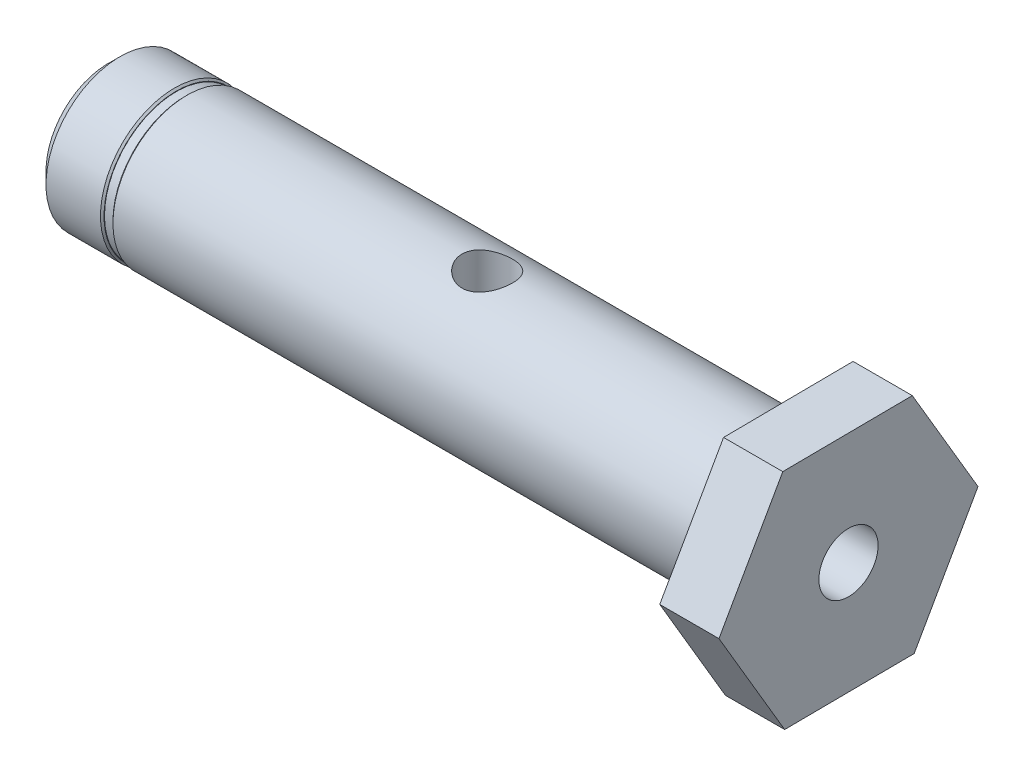
ISO-10303-21;
HEADER;
FILE_DESCRIPTION(('STEP AP214'),'2;1');
FILE_NAME('part.step','',(''),(''),'','','');
FILE_SCHEMA(('AUTOMOTIVE_DESIGN { 1 0 10303 214 1 1 1 1 }'));
ENDSEC;
DATA;
#1=APPLICATION_CONTEXT('core data for automotive mechanical design processes');
#2=APPLICATION_PROTOCOL_DEFINITION('international standard','automotive_design',2000,#1);
#3=PRODUCT_CONTEXT('',#1,'mechanical');
#4=PRODUCT('Part','Part','',(#3));
#5=PRODUCT_RELATED_PRODUCT_CATEGORY('part','',(#4));
#6=PRODUCT_DEFINITION_FORMATION('','',#4);
#7=PRODUCT_DEFINITION_CONTEXT('part definition',#1,'design');
#8=PRODUCT_DEFINITION('design','',#6,#7);
#9=PRODUCT_DEFINITION_SHAPE('','',#8);
#10=(LENGTH_UNIT() NAMED_UNIT(*) SI_UNIT(.MILLI.,.METRE.));
#11=(NAMED_UNIT(*) PLANE_ANGLE_UNIT() SI_UNIT($,.RADIAN.));
#12=(NAMED_UNIT(*) SI_UNIT($,.STERADIAN.) SOLID_ANGLE_UNIT());
#13=UNCERTAINTY_MEASURE_WITH_UNIT(LENGTH_MEASURE(1.E-05),#10,'distance_accuracy_value','');
#14=(GEOMETRIC_REPRESENTATION_CONTEXT(3) GLOBAL_UNCERTAINTY_ASSIGNED_CONTEXT((#13)) GLOBAL_UNIT_ASSIGNED_CONTEXT((#10,
#11,#12)) REPRESENTATION_CONTEXT('',''));
#15=CARTESIAN_POINT('',(0.,0.,0.));
#16=DIRECTION('',(0.,0.,1.));
#17=DIRECTION('',(1.,0.,0.));
#18=AXIS2_PLACEMENT_3D('',#15,#16,#17);
#19=CARTESIAN_POINT('',(115.,0.,0.));
#20=DIRECTION('',(-1.,0.,0.));
#21=DIRECTION('',(0.,0.,1.));
#22=AXIS2_PLACEMENT_3D('',#19,#20,#21);
#23=CYLINDRICAL_SURFACE('',#22,12.5);
#24=CARTESIAN_POINT('',(13.3,0.,0.));
#25=DIRECTION('',(-1.,0.,0.));
#26=DIRECTION('',(0.,0.,1.));
#27=AXIS2_PLACEMENT_3D('',#24,#25,#26);
#28=CIRCLE('',#27,12.5);
#29=CARTESIAN_POINT('',(13.3,0.,12.5));
#30=VERTEX_POINT('',#29);
#31=EDGE_CURVE('E179',#30,#30,#28,.F.);
#32=ORIENTED_EDGE('',*,*,#31,.T.);
#33=EDGE_LOOP('',(#32));
#34=FACE_BOUND('',#33,.T.);
#35=CARTESIAN_POINT('',(115.,0.,0.));
#36=DIRECTION('',(1.,0.,0.));
#37=DIRECTION('',(0.,0.,-1.));
#38=AXIS2_PLACEMENT_3D('',#35,#36,#37);
#39=CIRCLE('',#38,12.5);
#40=CARTESIAN_POINT('',(115.,0.,-12.5));
#41=VERTEX_POINT('',#40);
#42=EDGE_CURVE('E158',#41,#41,#39,.T.);
#43=ORIENTED_EDGE('',*,*,#42,.F.);
#44=EDGE_LOOP('',(#43));
#45=FACE_BOUND('',#44,.T.);
#46=CARTESIAN_POINT('',(64.,11.7553179455087,4.25000000000001));
#47=CARTESIAN_POINT('',(63.7688082243958,11.7553163048564,4.25000208635939));
#48=CARTESIAN_POINT('',(63.5376306111017,11.7622127031611,4.23107177309128));
#49=CARTESIAN_POINT('',(63.0821430943685,11.7889024426549,4.15611937649357));
#50=CARTESIAN_POINT('',(62.8578340991343,11.8086974817267,4.10009241001671));
#51=CARTESIAN_POINT('',(62.4227597886088,11.8586887228587,3.95315727615973));
#52=CARTESIAN_POINT('',(62.2119680573483,11.8888638561852,3.86231972243054));
#53=CARTESIAN_POINT('',(61.8085451145788,11.9561841704273,3.64858465717114));
#54=CARTESIAN_POINT('',(61.6159181723876,11.9933309838111,3.52567963418154));
#55=CARTESIAN_POINT('',(61.2464478386544,12.0721055733369,3.24593667986677));
#56=CARTESIAN_POINT('',(61.0704516300864,12.1138482614208,3.08801191357714));
#57=CARTESIAN_POINT('',(60.7468608782459,12.1961419607755,2.74502977872382));
#58=CARTESIAN_POINT('',(60.5992711064602,12.2366927708767,2.55996786105974));
#59=CARTESIAN_POINT('',(60.332803063851,12.3133695834904,2.16173358215594));
#60=CARTESIAN_POINT('',(60.2148175164114,12.3493447648353,1.9479322684075));
#61=CARTESIAN_POINT('',(60.0168239888865,12.4114588114545,1.50208314069309));
#62=CARTESIAN_POINT('',(59.9368053327207,12.4376004414402,1.27004047751297));
#63=CARTESIAN_POINT('',(59.819904815012,12.4762877361144,0.803181808925194));
#64=CARTESIAN_POINT('',(59.781570565411,12.4892899687544,0.568768024092829));
#65=CARTESIAN_POINT('',(59.7445035304582,12.5018568685094,0.0964986813327515));
#66=CARTESIAN_POINT('',(59.7457601346843,12.5014251359524,-0.141355937364765));
#67=CARTESIAN_POINT('',(59.7869293778599,12.4874792686763,-0.60345524442996));
#68=CARTESIAN_POINT('',(59.8252633639397,12.474499409838,-0.827859366125014));
#69=CARTESIAN_POINT('',(59.9368817672938,12.4375910854643,-1.26683563867679));
#70=CARTESIAN_POINT('',(60.0101685765457,12.4136618706201,-1.48140711554011));
#71=CARTESIAN_POINT('',(60.1905041300385,12.3568751775078,-1.8980164033555));
#72=CARTESIAN_POINT('',(60.2979923868106,12.3239022889639,-2.09984758406958));
#73=CARTESIAN_POINT('',(60.5433137607319,12.2524460502634,-2.48306659203639));
#74=CARTESIAN_POINT('',(60.681155550554,12.2139611262977,-2.66444855405648));
#75=CARTESIAN_POINT('',(60.9911745301492,12.1333048225972,-3.01099992399038));
#76=CARTESIAN_POINT('',(61.1647002678062,12.0910451976412,-3.17494418986543));
#77=CARTESIAN_POINT('',(61.5371276123441,12.0091752957356,-3.4718123267595));
#78=CARTESIAN_POINT('',(61.7360334573203,11.969565462949,-3.60473100646118));
#79=CARTESIAN_POINT('',(62.1575999287105,11.8969851778806,-3.83756473071075));
#80=CARTESIAN_POINT('',(62.3805784989992,11.8641260508176,-3.93694148373782));
#81=CARTESIAN_POINT('',(62.841505720852,11.8100543141711,-4.09631339640206));
#82=CARTESIAN_POINT('',(63.0794477426114,11.7888365866345,-4.15632586418346));
#83=CARTESIAN_POINT('',(63.551640096284,11.7616154920121,-4.23272709729825));
#84=CARTESIAN_POINT('',(63.7855435602831,11.7549476419358,-4.25102291540233));
#85=CARTESIAN_POINT('',(64.253124045222,11.7557200468072,-4.24888913268011));
#86=CARTESIAN_POINT('',(64.4868011009053,11.7631576046845,-4.22846693505826));
#87=CARTESIAN_POINT('',(64.9384588804628,11.7906383598649,-4.15119312232909));
#88=CARTESIAN_POINT('',(65.1567015418879,11.8102149538794,-4.09568855042673));
#89=CARTESIAN_POINT('',(65.5807242875293,11.8592485003546,-3.9514537893724));
#90=CARTESIAN_POINT('',(65.7865020988783,11.888707248384,-3.86271756175014));
#91=CARTESIAN_POINT('',(66.1872093806727,11.9553766913527,-3.65124748009679));
#92=CARTESIAN_POINT('',(66.3815646574045,11.9928092351957,-3.52749746510955));
#93=CARTESIAN_POINT('',(66.7474387202912,12.0707872460142,-3.25065304738288));
#94=CARTESIAN_POINT('',(66.9189504874256,12.1113336637695,-3.09754966045709));
#95=CARTESIAN_POINT('',(67.2432047947156,12.1934414759765,-2.75718975144257));
#96=CARTESIAN_POINT('',(67.3945664440502,12.2349510943746,-2.56860120561713));
#97=CARTESIAN_POINT('',(67.6635958933644,12.3123024299383,-2.16767839127812));
#98=CARTESIAN_POINT('',(67.7812647403048,12.3481443232058,-1.95534486089481));
#99=CARTESIAN_POINT('',(67.9785220351902,12.4099713333259,-1.51390748124953));
#100=CARTESIAN_POINT('',(68.0583455126643,12.4360170721838,-1.28491760269166));
#101=CARTESIAN_POINT('',(68.1780013666957,12.4755748071516,-0.815699002397323));
#102=CARTESIAN_POINT('',(68.2178488293486,12.489091531298,-0.575474556193985));
#103=CARTESIAN_POINT('',(68.2550209742181,12.50169717107,-0.103211830111087));
#104=CARTESIAN_POINT('',(68.2543244388139,12.501457487594,0.128654421017074));
#105=CARTESIAN_POINT('',(68.2153415064129,12.4882452162174,0.588812496753035));
#106=CARTESIAN_POINT('',(68.177058369155,12.4752737324961,0.817104629585829));
#107=CARTESIAN_POINT('',(68.0653164091026,12.438311718123,1.25973733436524));
#108=CARTESIAN_POINT('',(67.9924696892469,12.4145132190251,1.47424962273104));
#109=CARTESIAN_POINT('',(67.8142408217572,12.3583495347409,1.88808156366101));
#110=CARTESIAN_POINT('',(67.7088527146591,12.3259827805629,2.08739842506849));
#111=CARTESIAN_POINT('',(67.4639468867196,12.2544776933187,2.47341490547125));
#112=CARTESIAN_POINT('',(67.3232880355071,12.2151293747917,2.65935109194141));
#113=CARTESIAN_POINT('',(67.0137518219909,12.1345744052391,3.00562250583219));
#114=CARTESIAN_POINT('',(66.8448652740194,12.0933671524889,3.16594936631593));
#115=CARTESIAN_POINT('',(66.4753569274188,12.0117094140378,3.46317770167239));
#116=CARTESIAN_POINT('',(66.2737145025818,11.9713600094017,3.59884229876754));
#117=CARTESIAN_POINT('',(65.8492278836957,11.8980483180312,3.83428262236865));
#118=CARTESIAN_POINT('',(65.6263881664128,11.865084476414,3.9340659056497));
#119=CARTESIAN_POINT('',(65.1729356054837,11.8116162303556,4.0917578844551));
#120=CARTESIAN_POINT('',(64.9427949668864,11.7907491035731,4.15089676108841));
#121=CARTESIAN_POINT('',(64.4750959809143,11.7626034107323,4.23000923378122));
#122=CARTESIAN_POINT('',(64.237540515052,11.7553196312149,4.24999785634727));
#123=CARTESIAN_POINT('',(64.,11.7553179455087,4.25000000000001));
#124=B_SPLINE_CURVE_WITH_KNOTS('',3,(#46,#47,#48,#49,#50,#51,#52,#53,#54,#55,#56,#57,#58,#59,
#60,#61,#62,#63,#64,#65,#66,#67,#68,#69,#70,#71,#72,#73,#74,#75,#76,#77,#78,#79,#80,#81,#82,#83,
#84,#85,#86,#87,#88,#89,#90,#91,#92,#93,#94,#95,#96,#97,#98,#99,#100,#101,#102,#103,#104,#105,
#106,#107,#108,#109,#110,#111,#112,#113,#114,#115,#116,#117,#118,#119,#120,#121,#122,#123),
.UNSPECIFIED.,.T.,.F.,(4,2,2,2,2,2,2,2,2,2,2,2,2,2,2,2,2,2,2,2,2,2,2,2,2,2,2,2,2,2,2,2,2,2,2,2,
2,2,4),(0.,0.692694920384622,1.38548104047712,2.07686921235574,2.76841948009048,
3.48554525708903,4.20279138623514,4.9395969186036,5.67619514235266,6.38621339082409,
7.0960413547094,7.77691942027096,8.45784408804077,9.14789875658827,9.8381508453689,
10.5621283168264,11.2862268402086,12.0214474433795,12.7563445591683,13.456908323454,
14.1573381476705,14.8323840278356,15.5075526290563,16.2047830406201,16.902227195157,
17.6348081128836,18.3673662641226,19.0953134364972,19.8229857936747,20.515174766614,
21.2073037140138,21.8876085563469,22.5680380602091,23.2742297793021,23.9806517515895,
24.7161707244757,25.4515347027242,26.1635249917672,26.8752419537226),.UNSPECIFIED.);
#125=CARTESIAN_POINT('',(64.,11.7553179455087,4.25000000000001));
#126=VERTEX_POINT('',#125);
#127=EDGE_CURVE('E289',#126,#126,#124,.T.);
#128=ORIENTED_EDGE('',*,*,#127,.T.);
#129=EDGE_LOOP('',(#128));
#130=FACE_BOUND('',#129,.T.);
#131=CARTESIAN_POINT('',(64.,-11.7553179455087,4.25000000000001));
#132=CARTESIAN_POINT('',(64.2311917756042,-11.7553163048564,4.25000208635939));
#133=CARTESIAN_POINT('',(64.4623693888983,-11.7622127031611,4.23107177309128));
#134=CARTESIAN_POINT('',(64.9178569056315,-11.7889024426549,4.15611937649357));
#135=CARTESIAN_POINT('',(65.1421659008657,-11.8086974817267,4.10009241001671));
#136=CARTESIAN_POINT('',(65.5772402113912,-11.8586887228587,3.95315727615973));
#137=CARTESIAN_POINT('',(65.7880319426517,-11.8888638561852,3.86231972243054));
#138=CARTESIAN_POINT('',(66.1914548854212,-11.9561841704273,3.64858465717114));
#139=CARTESIAN_POINT('',(66.3840818276124,-11.9933309838111,3.52567963418154));
#140=CARTESIAN_POINT('',(66.7535521613456,-12.0721055733369,3.24593667986676));
#141=CARTESIAN_POINT('',(66.9295483699136,-12.1138482614208,3.08801191357713));
#142=CARTESIAN_POINT('',(67.2531391217541,-12.1961419607755,2.74502977872382));
#143=CARTESIAN_POINT('',(67.4007288935398,-12.2366927708767,2.55996786105974));
#144=CARTESIAN_POINT('',(67.667196936149,-12.3133695834904,2.16173358215593));
#145=CARTESIAN_POINT('',(67.7851824835886,-12.3493447648353,1.9479322684075));
#146=CARTESIAN_POINT('',(67.9831760111135,-12.4114588114545,1.50208314069309));
#147=CARTESIAN_POINT('',(68.0631946672793,-12.4376004414402,1.27004047751297));
#148=CARTESIAN_POINT('',(68.180095184988,-12.4762877361144,0.803181808925201));
#149=CARTESIAN_POINT('',(68.218429434589,-12.4892899687544,0.568768024092834));
#150=CARTESIAN_POINT('',(68.2554964695418,-12.5018568685094,0.0964986813327555));
#151=CARTESIAN_POINT('',(68.2542398653157,-12.5014251359524,-0.141355937364761));
#152=CARTESIAN_POINT('',(68.2130706221401,-12.4874792686763,-0.603455244429957));
#153=CARTESIAN_POINT('',(68.1747366360604,-12.474499409838,-0.827859366125014));
#154=CARTESIAN_POINT('',(68.0631182327062,-12.4375910854643,-1.26683563867679));
#155=CARTESIAN_POINT('',(67.9898314234543,-12.4136618706201,-1.48140711554011));
#156=CARTESIAN_POINT('',(67.8094958699615,-12.3568751775078,-1.8980164033555));
#157=CARTESIAN_POINT('',(67.7020076131894,-12.3239022889639,-2.09984758406959));
#158=CARTESIAN_POINT('',(67.4566862392681,-12.2524460502634,-2.4830665920364));
#159=CARTESIAN_POINT('',(67.318844449446,-12.2139611262977,-2.66444855405648));
#160=CARTESIAN_POINT('',(67.0088254698508,-12.1333048225972,-3.01099992399038));
#161=CARTESIAN_POINT('',(66.8352997321938,-12.0910451976412,-3.17494418986544));
#162=CARTESIAN_POINT('',(66.4628723876559,-12.0091752957355,-3.47181232675951));
#163=CARTESIAN_POINT('',(66.2639665426797,-11.9695654629489,-3.60473100646119));
#164=CARTESIAN_POINT('',(65.8424000712894,-11.8969851778806,-3.83756473071075));
#165=CARTESIAN_POINT('',(65.6194215010008,-11.8641260508176,-3.93694148373782));
#166=CARTESIAN_POINT('',(65.158494279148,-11.8100543141711,-4.09631339640206));
#167=CARTESIAN_POINT('',(64.9205522573886,-11.7888365866345,-4.15632586418346));
#168=CARTESIAN_POINT('',(64.448359903716,-11.7616154920121,-4.23272709729825));
#169=CARTESIAN_POINT('',(64.2144564397169,-11.7549476419358,-4.25102291540233));
#170=CARTESIAN_POINT('',(63.746875954778,-11.7557200468072,-4.24888913268011));
#171=CARTESIAN_POINT('',(63.5131988990948,-11.7631576046845,-4.22846693505826));
#172=CARTESIAN_POINT('',(63.0615411195372,-11.7906383598649,-4.15119312232909));
#173=CARTESIAN_POINT('',(62.8432984581121,-11.8102149538794,-4.09568855042673));
#174=CARTESIAN_POINT('',(62.4192757124707,-11.8592485003546,-3.9514537893724));
#175=CARTESIAN_POINT('',(62.2134979011217,-11.888707248384,-3.86271756175014));
#176=CARTESIAN_POINT('',(61.8127906193273,-11.9553766913527,-3.6512474800968));
#177=CARTESIAN_POINT('',(61.6184353425955,-11.9928092351957,-3.52749746510956));
#178=CARTESIAN_POINT('',(61.2525612797088,-12.0707872460142,-3.25065304738289));
#179=CARTESIAN_POINT('',(61.0810495125744,-12.1113336637695,-3.0975496604571));
#180=CARTESIAN_POINT('',(60.7567952052844,-12.1934414759765,-2.75718975144258));
#181=CARTESIAN_POINT('',(60.6054335559498,-12.2349510943746,-2.56860120561712));
#182=CARTESIAN_POINT('',(60.3364041066356,-12.3123024299383,-2.16767839127811));
#183=CARTESIAN_POINT('',(60.2187352596952,-12.3481443232058,-1.9553448608948));
#184=CARTESIAN_POINT('',(60.0214779648098,-12.4099713333259,-1.51390748124952));
#185=CARTESIAN_POINT('',(59.9416544873357,-12.4360170721838,-1.28491760269165));
#186=CARTESIAN_POINT('',(59.8219986333043,-12.4755748071516,-0.815699002397321));
#187=CARTESIAN_POINT('',(59.7821511706514,-12.489091531298,-0.575474556193985));
#188=CARTESIAN_POINT('',(59.7449790257819,-12.50169717107,-0.103211830111089));
#189=CARTESIAN_POINT('',(59.7456755611861,-12.501457487594,0.128654421017073));
#190=CARTESIAN_POINT('',(59.7846584935871,-12.4882452162174,0.588812496753035));
#191=CARTESIAN_POINT('',(59.822941630845,-12.4752737324961,0.817104629585829));
#192=CARTESIAN_POINT('',(59.9346835908974,-12.438311718123,1.25973733436524));
#193=CARTESIAN_POINT('',(60.007530310753,-12.4145132190251,1.47424962273104));
#194=CARTESIAN_POINT('',(60.1857591782428,-12.3583495347409,1.88808156366101));
#195=CARTESIAN_POINT('',(60.2911472853409,-12.3259827805629,2.08739842506849));
#196=CARTESIAN_POINT('',(60.5360531132804,-12.2544776933187,2.47341490547125));
#197=CARTESIAN_POINT('',(60.6767119644929,-12.2151293747917,2.65935109194141));
#198=CARTESIAN_POINT('',(60.9862481780091,-12.1345744052391,3.0056225058322));
#199=CARTESIAN_POINT('',(61.1551347259806,-12.0933671524889,3.16594936631593));
#200=CARTESIAN_POINT('',(61.5246430725812,-12.0117094140378,3.46317770167239));
#201=CARTESIAN_POINT('',(61.7262854974182,-11.9713600094017,3.59884229876754));
#202=CARTESIAN_POINT('',(62.1507721163043,-11.8980483180312,3.83428262236865));
#203=CARTESIAN_POINT('',(62.3736118335872,-11.865084476414,3.9340659056497));
#204=CARTESIAN_POINT('',(62.8270643945163,-11.8116162303556,4.0917578844551));
#205=CARTESIAN_POINT('',(63.0572050331136,-11.7907491035731,4.15089676108841));
#206=CARTESIAN_POINT('',(63.5249040190857,-11.7626034107323,4.23000923378122));
#207=CARTESIAN_POINT('',(63.762459484948,-11.7553196312149,4.24999785634727));
#208=CARTESIAN_POINT('',(64.,-11.7553179455087,4.25000000000001));
#209=B_SPLINE_CURVE_WITH_KNOTS('',3,(#131,#132,#133,#134,#135,#136,#137,#138,#139,#140,#141,
#142,#143,#144,#145,#146,#147,#148,#149,#150,#151,#152,#153,#154,#155,#156,#157,#158,#159,#160,
#161,#162,#163,#164,#165,#166,#167,#168,#169,#170,#171,#172,#173,#174,#175,#176,#177,#178,#179,
#180,#181,#182,#183,#184,#185,#186,#187,#188,#189,#190,#191,#192,#193,#194,#195,#196,#197,#198,
#199,#200,#201,#202,#203,#204,#205,#206,#207,#208),.UNSPECIFIED.,.T.,.F.,(4,2,2,2,2,2,2,2,2,2,2,
2,2,2,2,2,2,2,2,2,2,2,2,2,2,2,2,2,2,2,2,2,2,2,2,2,2,2,4),(0.,0.692694920384622,1.38548104047712,
2.07686921235574,2.76841948009048,3.48554525708903,4.20279138623516,4.9395969186036,
5.67619514235266,6.38621339082408,7.0960413547094,7.77691942027096,8.45784408804077,
9.14789875658828,9.8381508453689,10.5621283168265,11.2862268402086,12.0214474433796,
12.7563445591683,13.456908323454,14.1573381476705,14.8323840278356,15.5075526290563,
16.2047830406201,16.902227195157,17.6348081128836,18.3673662641226,19.0953134364972,
19.8229857936747,20.515174766614,21.2073037140138,21.8876085563469,22.5680380602091,
23.2742297793021,23.9806517515895,24.7161707244757,25.4515347027242,26.1635249917672,
26.8752419537226),.UNSPECIFIED.);
#210=CARTESIAN_POINT('',(64.,-11.7553179455087,4.25000000000001));
#211=VERTEX_POINT('',#210);
#212=EDGE_CURVE('E295',#211,#211,#209,.T.);
#213=ORIENTED_EDGE('',*,*,#212,.T.);
#214=EDGE_LOOP('',(#213));
#215=FACE_BOUND('',#214,.T.);
#216=ADVANCED_FACE('F40',(#34,#45,#130,#215),#23,.T.);
#217=CARTESIAN_POINT('',(125.,0.,0.));
#218=DIRECTION('',(1.,0.,0.));
#219=DIRECTION('',(0.,0.,-1.));
#220=AXIS2_PLACEMENT_3D('',#217,#218,#219);
#221=CYLINDRICAL_SURFACE('',#220,4.24999999999999);
#222=CARTESIAN_POINT('',(112.,0.,0.));
#223=DIRECTION('',(1.,0.,0.));
#224=DIRECTION('',(0.,0.,-1.));
#225=AXIS2_PLACEMENT_3D('',#222,#223,#224);
#226=CIRCLE('',#225,4.24999999999998);
#227=CARTESIAN_POINT('',(112.,0.,-4.24999999999998));
#228=VERTEX_POINT('',#227);
#229=EDGE_CURVE('E301',#228,#228,#226,.T.);
#230=ORIENTED_EDGE('',*,*,#229,.T.);
#231=EDGE_LOOP('',(#230));
#232=FACE_BOUND('',#231,.T.);
#233=CARTESIAN_POINT('',(64.,0.,0.));
#234=DIRECTION('',(0.707106781186547,-0.707106781186547,0.));
#235=DIRECTION('',(0.707106781186547,0.707106781186547,0.));
#236=AXIS2_PLACEMENT_3D('',#233,#234,#235);
#237=ELLIPSE('',#236,6.01040764008565,4.25);
#238=CARTESIAN_POINT('',(64.,0.,4.25));
#239=VERTEX_POINT('',#238);
#240=CARTESIAN_POINT('',(64.,0.,-4.25));
#241=VERTEX_POINT('',#240);
#242=EDGE_CURVE('E55',#239,#241,#237,.F.);
#243=ORIENTED_EDGE('',*,*,#242,.T.);
#244=CARTESIAN_POINT('',(64.,0.,0.));
#245=DIRECTION('',(0.707106781186547,0.707106781186547,0.));
#246=DIRECTION('',(0.707106781186547,-0.707106781186547,0.));
#247=AXIS2_PLACEMENT_3D('',#244,#245,#246);
#248=ELLIPSE('',#247,6.01040764008565,4.25);
#249=EDGE_CURVE('E174',#241,#239,#248,.F.);
#250=ORIENTED_EDGE('',*,*,#249,.T.);
#251=EDGE_LOOP('',(#243,#250));
#252=FACE_BOUND('',#251,.T.);
#253=ADVANCED_FACE('F197',(#232,#252),#221,.F.);
#254=CARTESIAN_POINT('',(125.,-19.0308478713212,10.7753906150657));
#255=DIRECTION('',(0.,0.999964735989179,0.00839802227264267));
#256=DIRECTION('',(0.,-0.00839802227264267,0.999964735989179));
#257=AXIS2_PLACEMENT_3D('',#254,#255,#256);
#258=PLANE('',#257);
#259=DIRECTION('',(0.,0.00839802227264267,-0.999964735989179));
#260=VECTOR('',#259,1.);
#261=CARTESIAN_POINT('',(115.,-19.0308478713212,10.7753906150657));
#262=LINE('',#261,#260);
#263=CARTESIAN_POINT('',(115.,-19.0308478713212,10.7753906150657));
#264=VERTEX_POINT('',#263);
#265=CARTESIAN_POINT('',(115.,-18.847185944008,-11.0935024045883));
#266=VERTEX_POINT('',#265);
#267=EDGE_CURVE('E137',#264,#266,#262,.T.);
#268=ORIENTED_EDGE('',*,*,#267,.T.);
#269=DIRECTION('',(-1.,0.,0.));
#270=VECTOR('',#269,1.);
#271=CARTESIAN_POINT('',(125.,-18.847185944008,-11.0935024045883));
#272=LINE('',#271,#270);
#273=CARTESIAN_POINT('',(125.,-18.847185944008,-11.0935024045883));
#274=VERTEX_POINT('',#273);
#275=EDGE_CURVE('E156',#274,#266,#272,.T.);
#276=ORIENTED_EDGE('',*,*,#275,.F.);
#277=DIRECTION('',(0.,0.00839802227264267,-0.999964735989179));
#278=VECTOR('',#277,1.);
#279=CARTESIAN_POINT('',(125.,-19.0308478713212,10.7753906150657));
#280=LINE('',#279,#278);
#281=CARTESIAN_POINT('',(125.,-19.0308478713212,10.7753906150657));
#282=VERTEX_POINT('',#281);
#283=EDGE_CURVE('E149',#282,#274,#280,.T.);
#284=ORIENTED_EDGE('',*,*,#283,.F.);
#285=DIRECTION('',(-1.,0.,0.));
#286=VECTOR('',#285,1.);
#287=CARTESIAN_POINT('',(125.,-19.0308478713212,10.7753906150657));
#288=LINE('',#287,#286);
#289=EDGE_CURVE('E133',#282,#264,#288,.T.);
#290=ORIENTED_EDGE('',*,*,#289,.T.);
#291=EDGE_LOOP('',(#268,#276,#284,#290));
#292=FACE_BOUND('',#291,.T.);
#293=ADVANCED_FACE('F203',(#292),#258,.F.);
#294=CARTESIAN_POINT('',(125.,-18.847185944008,-11.0935024045883));
#295=DIRECTION('',(0.,0.492709467364933,0.87019387539155));
#296=DIRECTION('',(0.,-0.87019387539155,0.492709467364933));
#297=AXIS2_PLACEMENT_3D('',#294,#295,#296);
#298=PLANE('',#297);
#299=DIRECTION('',(0.,0.87019387539155,-0.492709467364933));
#300=VECTOR('',#299,1.);
#301=CARTESIAN_POINT('',(115.,-18.847185944008,-11.0935024045883));
#302=LINE('',#301,#300);
#303=CARTESIAN_POINT('',(115.,0.1836619273133,-21.8688930196541));
#304=VERTEX_POINT('',#303);
#305=EDGE_CURVE('E140',#266,#304,#302,.T.);
#306=ORIENTED_EDGE('',*,*,#305,.T.);
#307=DIRECTION('',(-1.,0.,0.));
#308=VECTOR('',#307,1.);
#309=CARTESIAN_POINT('',(125.,0.1836619273133,-21.8688930196541));
#310=LINE('',#309,#308);
#311=CARTESIAN_POINT('',(125.,0.1836619273133,-21.8688930196541));
#312=VERTEX_POINT('',#311);
#313=EDGE_CURVE('E153',#312,#304,#310,.T.);
#314=ORIENTED_EDGE('',*,*,#313,.F.);
#315=DIRECTION('',(0.,0.87019387539155,-0.492709467364933));
#316=VECTOR('',#315,1.);
#317=CARTESIAN_POINT('',(125.,-18.847185944008,-11.0935024045883));
#318=LINE('',#317,#316);
#319=EDGE_CURVE('E100',#274,#312,#318,.T.);
#320=ORIENTED_EDGE('',*,*,#319,.F.);
#321=ORIENTED_EDGE('',*,*,#275,.T.);
#322=EDGE_LOOP('',(#306,#314,#320,#321));
#323=FACE_BOUND('',#322,.T.);
#324=ADVANCED_FACE('F245',(#323),#298,.F.);
#325=CARTESIAN_POINT('',(125.,0.1836619273133,-21.8688930196541));
#326=DIRECTION('',(0.,-0.507255268624246,0.861795853118907));
#327=DIRECTION('',(0.,-0.861795853118907,-0.507255268624246));
#328=AXIS2_PLACEMENT_3D('',#325,#326,#327);
#329=PLANE('',#328);
#330=DIRECTION('',(0.,0.861795853118907,0.507255268624246));
#331=VECTOR('',#330,1.);
#332=CARTESIAN_POINT('',(115.,0.1836619273133,-21.8688930196541));
#333=LINE('',#332,#331);
#334=CARTESIAN_POINT('',(115.,19.0308478713212,-10.7753906150657));
#335=VERTEX_POINT('',#334);
#336=EDGE_CURVE('E143',#304,#335,#333,.T.);
#337=ORIENTED_EDGE('',*,*,#336,.T.);
#338=DIRECTION('',(-1.,0.,0.));
#339=VECTOR('',#338,1.);
#340=CARTESIAN_POINT('',(125.,19.0308478713212,-10.7753906150657));
#341=LINE('',#340,#339);
#342=CARTESIAN_POINT('',(125.,19.0308478713212,-10.7753906150657));
#343=VERTEX_POINT('',#342);
#344=EDGE_CURVE('E128',#343,#335,#341,.T.);
#345=ORIENTED_EDGE('',*,*,#344,.F.);
#346=DIRECTION('',(0.,0.861795853118907,0.507255268624246));
#347=VECTOR('',#346,1.);
#348=CARTESIAN_POINT('',(125.,0.1836619273133,-21.8688930196541));
#349=LINE('',#348,#347);
#350=EDGE_CURVE('E116',#312,#343,#349,.T.);
#351=ORIENTED_EDGE('',*,*,#350,.F.);
#352=ORIENTED_EDGE('',*,*,#313,.T.);
#353=EDGE_LOOP('',(#337,#345,#351,#352));
#354=FACE_BOUND('',#353,.T.);
#355=ADVANCED_FACE('F249',(#354),#329,.F.);
#356=CARTESIAN_POINT('',(125.,19.0308478713212,-10.7753906150657));
#357=DIRECTION('',(0.,-0.999964735989179,-0.00839802227264267));
#358=DIRECTION('',(0.,0.00839802227264267,-0.999964735989179));
#359=AXIS2_PLACEMENT_3D('',#356,#357,#358);
#360=PLANE('',#359);
#361=DIRECTION('',(0.,-0.00839802227264267,0.999964735989179));
#362=VECTOR('',#361,1.);
#363=CARTESIAN_POINT('',(115.,19.0308478713212,-10.7753906150657));
#364=LINE('',#363,#362);
#365=CARTESIAN_POINT('',(115.,18.847185944008,11.0935024045884));
#366=VERTEX_POINT('',#365);
#367=EDGE_CURVE('E125',#335,#366,#364,.T.);
#368=ORIENTED_EDGE('',*,*,#367,.T.);
#369=DIRECTION('',(-1.,0.,0.));
#370=VECTOR('',#369,1.);
#371=CARTESIAN_POINT('',(125.,18.847185944008,11.0935024045884));
#372=LINE('',#371,#370);
#373=CARTESIAN_POINT('',(125.,18.847185944008,11.0935024045884));
#374=VERTEX_POINT('',#373);
#375=EDGE_CURVE('E122',#374,#366,#372,.T.);
#376=ORIENTED_EDGE('',*,*,#375,.F.);
#377=DIRECTION('',(0.,-0.00839802227264267,0.999964735989179));
#378=VECTOR('',#377,1.);
#379=CARTESIAN_POINT('',(125.,19.0308478713212,-10.7753906150657));
#380=LINE('',#379,#378);
#381=EDGE_CURVE('E109',#343,#374,#380,.T.);
#382=ORIENTED_EDGE('',*,*,#381,.F.);
#383=ORIENTED_EDGE('',*,*,#344,.T.);
#384=EDGE_LOOP('',(#368,#376,#382,#383));
#385=FACE_BOUND('',#384,.T.);
#386=ADVANCED_FACE('F123',(#385),#360,.F.);
#387=CARTESIAN_POINT('',(125.,18.847185944008,11.0935024045884));
#388=DIRECTION('',(0.,-0.492709467364933,-0.87019387539155));
#389=DIRECTION('',(0.,0.87019387539155,-0.492709467364933));
#390=AXIS2_PLACEMENT_3D('',#387,#388,#389);
#391=PLANE('',#390);
#392=DIRECTION('',(0.,-0.87019387539155,0.492709467364933));
#393=VECTOR('',#392,1.);
#394=CARTESIAN_POINT('',(115.,18.847185944008,11.0935024045884));
#395=LINE('',#394,#393);
#396=CARTESIAN_POINT('',(115.,-0.18366192731329,21.8688930196541));
#397=VERTEX_POINT('',#396);
#398=EDGE_CURVE('E146',#366,#397,#395,.T.);
#399=ORIENTED_EDGE('',*,*,#398,.T.);
#400=DIRECTION('',(-1.,0.,0.));
#401=VECTOR('',#400,1.);
#402=CARTESIAN_POINT('',(125.,-0.18366192731329,21.8688930196541));
#403=LINE('',#402,#401);
#404=CARTESIAN_POINT('',(125.,-0.18366192731329,21.8688930196541));
#405=VERTEX_POINT('',#404);
#406=EDGE_CURVE('E129',#405,#397,#403,.T.);
#407=ORIENTED_EDGE('',*,*,#406,.F.);
#408=DIRECTION('',(0.,-0.87019387539155,0.492709467364933));
#409=VECTOR('',#408,1.);
#410=CARTESIAN_POINT('',(125.,18.847185944008,11.0935024045884));
#411=LINE('',#410,#409);
#412=EDGE_CURVE('E113',#374,#405,#411,.T.);
#413=ORIENTED_EDGE('',*,*,#412,.F.);
#414=ORIENTED_EDGE('',*,*,#375,.T.);
#415=EDGE_LOOP('',(#399,#407,#413,#414));
#416=FACE_BOUND('',#415,.T.);
#417=ADVANCED_FACE('F131',(#416),#391,.F.);
#418=CARTESIAN_POINT('',(125.,-0.18366192731329,21.8688930196541));
#419=DIRECTION('',(0.,0.507255268624246,-0.861795853118907));
#420=DIRECTION('',(0.,0.861795853118907,0.507255268624246));
#421=AXIS2_PLACEMENT_3D('',#418,#419,#420);
#422=PLANE('',#421);
#423=DIRECTION('',(0.,-0.861795853118907,-0.507255268624246));
#424=VECTOR('',#423,1.);
#425=CARTESIAN_POINT('',(115.,-0.18366192731329,21.8688930196541));
#426=LINE('',#425,#424);
#427=EDGE_CURVE('E91',#397,#264,#426,.T.);
#428=ORIENTED_EDGE('',*,*,#427,.T.);
#429=ORIENTED_EDGE('',*,*,#289,.F.);
#430=DIRECTION('',(0.,-0.861795853118907,-0.507255268624246));
#431=VECTOR('',#430,1.);
#432=CARTESIAN_POINT('',(125.,-0.18366192731329,21.8688930196541));
#433=LINE('',#432,#431);
#434=EDGE_CURVE('E64',#405,#282,#433,.T.);
#435=ORIENTED_EDGE('',*,*,#434,.F.);
#436=ORIENTED_EDGE('',*,*,#406,.T.);
#437=EDGE_LOOP('',(#428,#429,#435,#436));
#438=FACE_BOUND('',#437,.T.);
#439=ADVANCED_FACE('F257',(#438),#422,.F.);
#440=CARTESIAN_POINT('',(125.,0.,0.));
#441=DIRECTION('',(1.,0.,0.));
#442=DIRECTION('',(0.,0.,-1.));
#443=AXIS2_PLACEMENT_3D('',#440,#441,#442);
#444=PLANE('',#443);
#445=CARTESIAN_POINT('',(125.,0.,0.));
#446=DIRECTION('',(1.,0.,0.));
#447=DIRECTION('',(0.,0.,-1.));
#448=AXIS2_PLACEMENT_3D('',#445,#446,#447);
#449=CIRCLE('',#448,5.);
#450=CARTESIAN_POINT('',(125.,0.,-5.));
#451=VERTEX_POINT('',#450);
#452=EDGE_CURVE('E304',#451,#451,#449,.T.);
#453=ORIENTED_EDGE('',*,*,#452,.F.);
#454=EDGE_LOOP('',(#453));
#455=FACE_BOUND('',#454,.T.);
#456=ORIENTED_EDGE('',*,*,#283,.T.);
#457=ORIENTED_EDGE('',*,*,#319,.T.);
#458=ORIENTED_EDGE('',*,*,#350,.T.);
#459=ORIENTED_EDGE('',*,*,#381,.T.);
#460=ORIENTED_EDGE('',*,*,#412,.T.);
#461=ORIENTED_EDGE('',*,*,#434,.T.);
#462=EDGE_LOOP('',(#456,#457,#458,#459,#460,#461));
#463=FACE_BOUND('',#462,.T.);
#464=ADVANCED_FACE('F111',(#455,#463),#444,.T.);
#465=CARTESIAN_POINT('',(115.,0.,0.));
#466=DIRECTION('',(1.,0.,0.));
#467=DIRECTION('',(0.,0.,-1.));
#468=AXIS2_PLACEMENT_3D('',#465,#466,#467);
#469=PLANE('',#468);
#470=ORIENTED_EDGE('',*,*,#42,.T.);
#471=EDGE_LOOP('',(#470));
#472=FACE_BOUND('',#471,.T.);
#473=ORIENTED_EDGE('',*,*,#267,.F.);
#474=ORIENTED_EDGE('',*,*,#427,.F.);
#475=ORIENTED_EDGE('',*,*,#398,.F.);
#476=ORIENTED_EDGE('',*,*,#367,.F.);
#477=ORIENTED_EDGE('',*,*,#336,.F.);
#478=ORIENTED_EDGE('',*,*,#305,.F.);
#479=EDGE_LOOP('',(#473,#474,#475,#476,#477,#478));
#480=FACE_BOUND('',#479,.T.);
#481=ADVANCED_FACE('F260',(#472,#480),#469,.F.);
#482=CARTESIAN_POINT('',(112.,0.,0.));
#483=DIRECTION('',(1.,0.,0.));
#484=DIRECTION('',(0.,0.,-1.));
#485=AXIS2_PLACEMENT_3D('',#482,#483,#484);
#486=CYLINDRICAL_SURFACE('',#485,5.);
#487=CARTESIAN_POINT('',(112.,0.,0.));
#488=DIRECTION('',(1.,0.,0.));
#489=DIRECTION('',(0.,0.,-1.));
#490=AXIS2_PLACEMENT_3D('',#487,#488,#489);
#491=CIRCLE('',#490,5.);
#492=CARTESIAN_POINT('',(112.,0.,-5.));
#493=VERTEX_POINT('',#492);
#494=EDGE_CURVE('E305',#493,#493,#491,.T.);
#495=CARTESIAN_POINT('',(112.,0.,-5.));
#496=CARTESIAN_POINT('',(112.135416666667,0.,-5.));
#497=CARTESIAN_POINT('',(112.270833333333,0.,-5.));
#498=CARTESIAN_POINT('',(112.541666666667,0.,-5.));
#499=CARTESIAN_POINT('',(112.677083333333,0.,-5.));
#500=CARTESIAN_POINT('',(112.947916666667,0.,-5.));
#501=CARTESIAN_POINT('',(113.083333333333,0.,-5.));
#502=CARTESIAN_POINT('',(113.354166666667,0.,-5.));
#503=CARTESIAN_POINT('',(113.489583333333,0.,-5.));
#504=CARTESIAN_POINT('',(113.760416666667,0.,-5.));
#505=CARTESIAN_POINT('',(113.895833333333,0.,-5.));
#506=CARTESIAN_POINT('',(114.166666666667,0.,-5.));
#507=CARTESIAN_POINT('',(114.302083333333,0.,-5.));
#508=CARTESIAN_POINT('',(114.572916666667,0.,-5.));
#509=CARTESIAN_POINT('',(114.708333333333,0.,-5.));
#510=CARTESIAN_POINT('',(114.979166666667,0.,-5.));
#511=CARTESIAN_POINT('',(115.114583333333,0.,-5.));
#512=CARTESIAN_POINT('',(115.385416666667,0.,-5.));
#513=CARTESIAN_POINT('',(115.520833333333,0.,-5.));
#514=CARTESIAN_POINT('',(115.791666666667,0.,-5.));
#515=CARTESIAN_POINT('',(115.927083333333,0.,-5.));
#516=CARTESIAN_POINT('',(116.197916666667,0.,-5.));
#517=CARTESIAN_POINT('',(116.333333333333,0.,-5.));
#518=CARTESIAN_POINT('',(116.604166666667,0.,-5.));
#519=CARTESIAN_POINT('',(116.739583333333,0.,-5.));
#520=CARTESIAN_POINT('',(117.010416666667,0.,-5.));
#521=CARTESIAN_POINT('',(117.145833333333,0.,-5.));
#522=CARTESIAN_POINT('',(117.416666666667,0.,-5.));
#523=CARTESIAN_POINT('',(117.552083333333,0.,-5.));
#524=CARTESIAN_POINT('',(117.822916666667,0.,-5.));
#525=CARTESIAN_POINT('',(117.958333333333,0.,-5.));
#526=CARTESIAN_POINT('',(118.229166666667,0.,-5.));
#527=CARTESIAN_POINT('',(118.364583333333,0.,-5.));
#528=CARTESIAN_POINT('',(118.635416666667,0.,-5.));
#529=CARTESIAN_POINT('',(118.770833333333,0.,-5.));
#530=CARTESIAN_POINT('',(119.041666666667,0.,-5.));
#531=CARTESIAN_POINT('',(119.177083333333,0.,-5.));
#532=CARTESIAN_POINT('',(119.447916666667,0.,-5.));
#533=CARTESIAN_POINT('',(119.583333333333,0.,-5.));
#534=CARTESIAN_POINT('',(119.854166666667,0.,-5.));
#535=CARTESIAN_POINT('',(119.989583333333,0.,-5.));
#536=CARTESIAN_POINT('',(120.260416666667,0.,-5.));
#537=CARTESIAN_POINT('',(120.395833333333,0.,-5.));
#538=CARTESIAN_POINT('',(120.666666666667,0.,-5.));
#539=CARTESIAN_POINT('',(120.802083333333,0.,-5.));
#540=CARTESIAN_POINT('',(121.072916666667,0.,-5.));
#541=CARTESIAN_POINT('',(121.208333333333,0.,-5.));
#542=CARTESIAN_POINT('',(121.479166666667,0.,-5.));
#543=CARTESIAN_POINT('',(121.614583333333,0.,-5.));
#544=CARTESIAN_POINT('',(121.885416666667,0.,-5.));
#545=CARTESIAN_POINT('',(122.020833333333,0.,-5.));
#546=CARTESIAN_POINT('',(122.291666666667,0.,-5.));
#547=CARTESIAN_POINT('',(122.427083333333,0.,-5.));
#548=CARTESIAN_POINT('',(122.697916666667,0.,-5.));
#549=CARTESIAN_POINT('',(122.833333333333,0.,-5.));
#550=CARTESIAN_POINT('',(123.104166666667,0.,-5.));
#551=CARTESIAN_POINT('',(123.239583333333,0.,-5.));
#552=CARTESIAN_POINT('',(123.510416666667,0.,-5.));
#553=CARTESIAN_POINT('',(123.645833333333,0.,-5.));
#554=CARTESIAN_POINT('',(123.916666666667,0.,-5.));
#555=CARTESIAN_POINT('',(124.052083333333,0.,-5.));
#556=CARTESIAN_POINT('',(124.322916666667,0.,-5.));
#557=CARTESIAN_POINT('',(124.458333333333,0.,-5.));
#558=CARTESIAN_POINT('',(124.729166666667,0.,-5.));
#559=CARTESIAN_POINT('',(124.864583333333,0.,-5.));
#560=CARTESIAN_POINT('',(125.,0.,-5.));
#561=B_SPLINE_CURVE_WITH_KNOTS('',3,(#495,#496,#497,#498,#499,#500,#501,#502,#503,#504,#505,
#506,#507,#508,#509,#510,#511,#512,#513,#514,#515,#516,#517,#518,#519,#520,#521,#522,#523,#524,
#525,#526,#527,#528,#529,#530,#531,#532,#533,#534,#535,#536,#537,#538,#539,#540,#541,#542,#543,
#544,#545,#546,#547,#548,#549,#550,#551,#552,#553,#554,#555,#556,#557,#558,#559,#560),
.UNSPECIFIED.,.F.,.F.,(4,2,2,2,2,2,2,2,2,2,2,2,2,2,2,2,2,2,2,2,2,2,2,2,2,2,2,2,2,2,2,2,4),(0.,
0.406249999999997,0.812499999999994,1.21874999999999,1.62499999999999,2.03125,2.4375,
2.84374999999999,3.24999999999999,3.65624999999999,4.0625,4.46874999999999,4.87499999999999,
5.28124999999999,5.6875,6.09374999999999,6.49999999999999,6.90624999999999,7.31249999999999,
7.71875,8.12499999999999,8.53124999999999,8.93749999999999,9.34374999999998,9.74999999999999,
10.15625,10.5625,10.96875,11.375,11.78125,12.1875,12.59375,13.),.UNSPECIFIED.);
#562=EDGE_CURVE('BSEAM263',#493,#451,#561,.T.);
#563=ORIENTED_EDGE('',*,*,#494,.F.);
#564=ORIENTED_EDGE('',*,*,#452,.T.);
#565=ORIENTED_EDGE('',*,*,#562,.T.);
#566=ORIENTED_EDGE('',*,*,#562,.F.);
#567=EDGE_LOOP('',(#563,#565,#564,#566));
#568=FACE_BOUND('',#567,.T.);
#569=ADVANCED_FACE('F263',(#568),#486,.F.);
#570=CARTESIAN_POINT('',(112.,0.,0.));
#571=DIRECTION('',(1.,0.,0.));
#572=DIRECTION('',(0.,0.,-1.));
#573=AXIS2_PLACEMENT_3D('',#570,#571,#572);
#574=PLANE('',#573);
#575=ORIENTED_EDGE('',*,*,#229,.F.);
#576=EDGE_LOOP('',(#575));
#577=FACE_BOUND('',#576,.T.);
#578=ORIENTED_EDGE('',*,*,#494,.T.);
#579=EDGE_LOOP('',(#578));
#580=FACE_BOUND('',#579,.T.);
#581=ADVANCED_FACE('F278',(#577,#580),#574,.T.);
#582=CARTESIAN_POINT('',(64.,-19.0308478713212,0.));
#583=DIRECTION('',(0.,1.,0.));
#584=DIRECTION('',(0.,0.,1.));
#585=AXIS2_PLACEMENT_3D('',#582,#583,#584);
#586=CYLINDRICAL_SURFACE('',#585,4.25000000000001);
#587=ORIENTED_EDGE('',*,*,#242,.F.);
#588=CARTESIAN_POINT('',(64.,0.,0.));
#589=DIRECTION('',(0.707106781186547,0.707106781186547,0.));
#590=DIRECTION('',(0.707106781186547,-0.707106781186547,0.));
#591=AXIS2_PLACEMENT_3D('',#588,#589,#590);
#592=ELLIPSE('',#591,6.01040764008565,4.25);
#593=EDGE_CURVE('E171',#241,#239,#592,.T.);
#594=ORIENTED_EDGE('',*,*,#593,.F.);
#595=EDGE_LOOP('',(#587,#594));
#596=FACE_BOUND('',#595,.T.);
#597=ORIENTED_EDGE('',*,*,#127,.F.);
#598=EDGE_LOOP('',(#597));
#599=FACE_BOUND('',#598,.T.);
#600=ADVANCED_FACE('F270',(#596,#599),#586,.F.);
#601=CARTESIAN_POINT('',(55.,0.,0.));
#602=DIRECTION('',(1.,0.,0.));
#603=DIRECTION('',(0.,0.,-1.));
#604=AXIS2_PLACEMENT_3D('',#601,#602,#603);
#605=CONICAL_SURFACE('',#604,4.24999999999998,1.02974425867665);
#606=CARTESIAN_POINT('',(52.4463423691329,0.,0.));
#607=VERTEX_POINT('',#606);
#608=VERTEX_LOOP('',#607);
#609=FACE_BOUND('',#608,.T.);
#610=CARTESIAN_POINT('',(55.,0.,0.));
#611=DIRECTION('',(1.,0.,0.));
#612=DIRECTION('',(0.,0.,-1.));
#613=AXIS2_PLACEMENT_3D('',#610,#611,#612);
#614=CIRCLE('',#613,4.24999999999998);
#615=CARTESIAN_POINT('',(55.,0.,-4.24999999999998));
#616=VERTEX_POINT('',#615);
#617=EDGE_CURVE('E141',#616,#616,#614,.T.);
#618=ORIENTED_EDGE('',*,*,#617,.T.);
#619=EDGE_LOOP('',(#618));
#620=FACE_BOUND('',#619,.T.);
#621=ADVANCED_FACE('F268',(#609,#620),#605,.F.);
#622=CARTESIAN_POINT('',(64.,0.,0.));
#623=DIRECTION('',(0.707106781186547,-0.707106781186547,0.));
#624=DIRECTION('',(0.707106781186547,0.707106781186547,0.));
#625=AXIS2_PLACEMENT_3D('',#622,#623,#624);
#626=ELLIPSE('',#625,6.01040764008565,4.25);
#627=EDGE_CURVE('E168',#239,#241,#626,.T.);
#628=ORIENTED_EDGE('',*,*,#627,.T.);
#629=ORIENTED_EDGE('',*,*,#593,.T.);
#630=EDGE_LOOP('',(#628,#629));
#631=FACE_BOUND('',#630,.T.);
#632=ORIENTED_EDGE('',*,*,#617,.F.);
#633=EDGE_LOOP('',(#632));
#634=FACE_BOUND('',#633,.T.);
#635=ADVANCED_FACE('F206',(#631,#634),#221,.F.);
#636=ORIENTED_EDGE('',*,*,#627,.F.);
#637=ORIENTED_EDGE('',*,*,#249,.F.);
#638=EDGE_LOOP('',(#636,#637));
#639=FACE_BOUND('',#638,.T.);
#640=ORIENTED_EDGE('',*,*,#212,.F.);
#641=EDGE_LOOP('',(#640));
#642=FACE_BOUND('',#641,.T.);
#643=ADVANCED_FACE('F274',(#639,#642),#586,.F.);
#644=CARTESIAN_POINT('',(11.5,16.8872697218675,0.));
#645=DIRECTION('',(1.,0.,0.));
#646=DIRECTION('',(0.,0.,-1.));
#647=AXIS2_PLACEMENT_3D('',#644,#645,#646);
#648=PLANE('',#647);
#649=CARTESIAN_POINT('',(11.5,0.,0.));
#650=DIRECTION('',(1.,0.,0.));
#651=DIRECTION('',(0.,0.,-1.));
#652=AXIS2_PLACEMENT_3D('',#649,#650,#651);
#653=CIRCLE('',#652,12.2);
#654=CARTESIAN_POINT('',(11.5,0.,-12.2));
#655=VERTEX_POINT('',#654);
#656=EDGE_CURVE('E49',#655,#655,#653,.T.);
#657=ORIENTED_EDGE('',*,*,#656,.T.);
#658=EDGE_LOOP('',(#657));
#659=FACE_BOUND('',#658,.T.);
#660=CARTESIAN_POINT('',(11.5,0.,0.));
#661=DIRECTION('',(-1.,0.,0.));
#662=DIRECTION('',(0.,0.,1.));
#663=AXIS2_PLACEMENT_3D('',#660,#661,#662);
#664=CIRCLE('',#663,12.125);
#665=CARTESIAN_POINT('',(11.5,0.,12.125));
#666=VERTEX_POINT('',#665);
#667=EDGE_CURVE('E329',#666,#666,#664,.T.);
#668=ORIENTED_EDGE('',*,*,#667,.T.);
#669=EDGE_LOOP('',(#668));
#670=FACE_BOUND('',#669,.T.);
#671=ADVANCED_FACE('F184',(#659,#670),#648,.T.);
#672=CARTESIAN_POINT('',(13.,16.8872697218675,0.));
#673=DIRECTION('',(-1.,0.,0.));
#674=DIRECTION('',(0.,0.,1.));
#675=AXIS2_PLACEMENT_3D('',#672,#673,#674);
#676=PLANE('',#675);
#677=CARTESIAN_POINT('',(13.,0.,0.));
#678=DIRECTION('',(-1.,0.,0.));
#679=DIRECTION('',(0.,0.,1.));
#680=AXIS2_PLACEMENT_3D('',#677,#678,#679);
#681=CIRCLE('',#680,12.2);
#682=CARTESIAN_POINT('',(13.,0.,12.2));
#683=VERTEX_POINT('',#682);
#684=EDGE_CURVE('E176',#683,#683,#681,.T.);
#685=ORIENTED_EDGE('',*,*,#684,.T.);
#686=EDGE_LOOP('',(#685));
#687=FACE_BOUND('',#686,.T.);
#688=CARTESIAN_POINT('',(13.,0.,0.));
#689=DIRECTION('',(-1.,0.,0.));
#690=DIRECTION('',(0.,0.,1.));
#691=AXIS2_PLACEMENT_3D('',#688,#689,#690);
#692=CIRCLE('',#691,12.125);
#693=CARTESIAN_POINT('',(13.,0.,12.125));
#694=VERTEX_POINT('',#693);
#695=EDGE_CURVE('E333',#694,#694,#692,.T.);
#696=ORIENTED_EDGE('',*,*,#695,.F.);
#697=EDGE_LOOP('',(#696));
#698=FACE_BOUND('',#697,.T.);
#699=ADVANCED_FACE('F239',(#687,#698),#676,.T.);
#700=CARTESIAN_POINT('',(-5.77941449903356,0.,0.));
#701=DIRECTION('',(-1.,0.,0.));
#702=DIRECTION('',(0.,0.,1.));
#703=AXIS2_PLACEMENT_3D('',#700,#701,#702);
#704=CYLINDRICAL_SURFACE('',#703,12.125);
#705=ORIENTED_EDGE('',*,*,#695,.T.);
#706=EDGE_LOOP('',(#705));
#707=FACE_BOUND('',#706,.T.);
#708=ORIENTED_EDGE('',*,*,#667,.F.);
#709=EDGE_LOOP('',(#708));
#710=FACE_BOUND('',#709,.T.);
#711=ADVANCED_FACE('F225',(#707,#710),#704,.T.);
#712=CARTESIAN_POINT('',(0.,0.,0.));
#713=DIRECTION('',(1.,0.,0.));
#714=DIRECTION('',(0.,0.,-1.));
#715=AXIS2_PLACEMENT_3D('',#712,#713,#714);
#716=PLANE('',#715);
#717=CARTESIAN_POINT('',(0.,0.,0.));
#718=DIRECTION('',(1.,0.,0.));
#719=DIRECTION('',(0.,0.,-1.));
#720=AXIS2_PLACEMENT_3D('',#717,#718,#719);
#721=CIRCLE('',#720,10.5);
#722=CARTESIAN_POINT('',(0.,0.,-10.5));
#723=VERTEX_POINT('',#722);
#724=EDGE_CURVE('E164',#723,#723,#721,.F.);
#725=ORIENTED_EDGE('',*,*,#724,.T.);
#726=EDGE_LOOP('',(#725));
#727=FACE_BOUND('',#726,.T.);
#728=ADVANCED_FACE('F217',(#727),#716,.F.);
#729=CARTESIAN_POINT('',(2.,0.,0.));
#730=DIRECTION('',(1.,0.,0.));
#731=DIRECTION('',(0.,0.,-1.));
#732=AXIS2_PLACEMENT_3D('',#729,#730,#731);
#733=CONICAL_SURFACE('',#732,12.5,0.785398163397449);
#734=ORIENTED_EDGE('',*,*,#724,.F.);
#735=EDGE_LOOP('',(#734));
#736=FACE_BOUND('',#735,.T.);
#737=CARTESIAN_POINT('',(2.,0.,0.));
#738=DIRECTION('',(1.,0.,0.));
#739=DIRECTION('',(0.,0.,-1.));
#740=AXIS2_PLACEMENT_3D('',#737,#738,#739);
#741=CIRCLE('',#740,12.5);
#742=CARTESIAN_POINT('',(2.,0.,-12.5));
#743=VERTEX_POINT('',#742);
#744=EDGE_CURVE('E161',#743,#743,#741,.T.);
#745=ORIENTED_EDGE('',*,*,#744,.F.);
#746=EDGE_LOOP('',(#745));
#747=FACE_BOUND('',#746,.T.);
#748=ADVANCED_FACE('F212',(#736,#747),#733,.T.);
#749=CARTESIAN_POINT('',(11.2,0.,0.));
#750=DIRECTION('',(1.,0.,0.));
#751=DIRECTION('',(0.,0.,-1.));
#752=AXIS2_PLACEMENT_3D('',#749,#750,#751);
#753=CIRCLE('',#752,12.5);
#754=CARTESIAN_POINT('',(11.2,0.,-12.5));
#755=VERTEX_POINT('',#754);
#756=EDGE_CURVE('E11',#755,#755,#753,.F.);
#757=ORIENTED_EDGE('',*,*,#756,.T.);
#758=EDGE_LOOP('',(#757));
#759=FACE_BOUND('',#758,.T.);
#760=ORIENTED_EDGE('',*,*,#744,.T.);
#761=EDGE_LOOP('',(#760));
#762=FACE_BOUND('',#761,.T.);
#763=ADVANCED_FACE('F193',(#759,#762),#23,.T.);
#764=CARTESIAN_POINT('',(13.,0.,0.));
#765=DIRECTION('',(1.,0.,0.));
#766=DIRECTION('',(0.,0.,-1.));
#767=AXIS2_PLACEMENT_3D('',#764,#765,#766);
#768=CONICAL_SURFACE('',#767,12.2,0.785398163397431);
#769=ORIENTED_EDGE('',*,*,#31,.F.);
#770=EDGE_LOOP('',(#769));
#771=FACE_BOUND('',#770,.T.);
#772=ORIENTED_EDGE('',*,*,#684,.F.);
#773=EDGE_LOOP('',(#772));
#774=FACE_BOUND('',#773,.T.);
#775=ADVANCED_FACE('F188',(#771,#774),#768,.T.);
#776=CARTESIAN_POINT('',(11.5,0.,0.));
#777=DIRECTION('',(-1.,0.,0.));
#778=DIRECTION('',(0.,0.,1.));
#779=AXIS2_PLACEMENT_3D('',#776,#777,#778);
#780=CONICAL_SURFACE('',#779,12.2,0.785398163397431);
#781=ORIENTED_EDGE('',*,*,#756,.F.);
#782=EDGE_LOOP('',(#781));
#783=FACE_BOUND('',#782,.T.);
#784=ORIENTED_EDGE('',*,*,#656,.F.);
#785=EDGE_LOOP('',(#784));
#786=FACE_BOUND('',#785,.T.);
#787=ADVANCED_FACE('F43',(#783,#786),#780,.T.);
#788=CLOSED_SHELL('',(#216,#253,#293,#324,#355,#386,#417,#439,#464,#481,#569,#581,#600,#621,
#635,#643,#671,#699,#711,#728,#748,#763,#775,#787));
#789=MANIFOLD_SOLID_BREP('B2',#788);
#790=ADVANCED_BREP_SHAPE_REPRESENTATION('',(#18,#789),#14);
#791=SHAPE_DEFINITION_REPRESENTATION(#9,#790);
ENDSEC;
END-ISO-10303-21;
